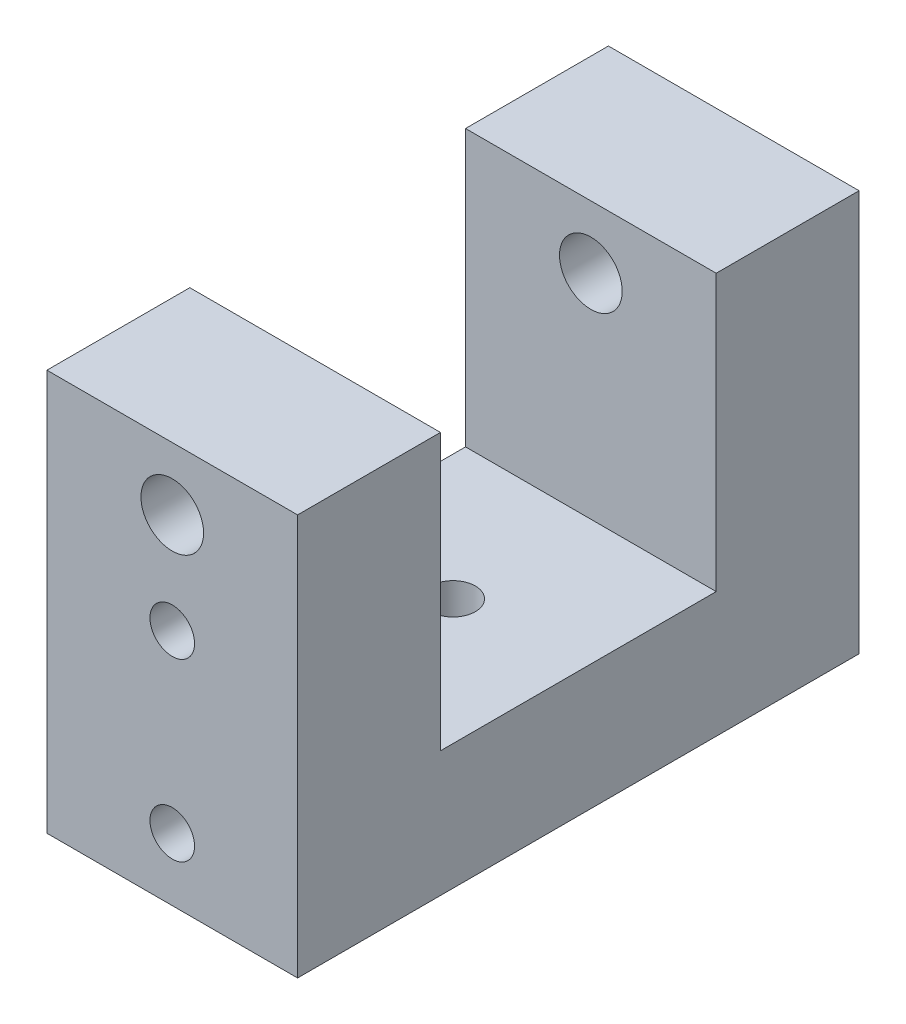
ISO-10303-21;
HEADER;
FILE_DESCRIPTION(('STEP AP214'),'2;1');
FILE_NAME('part.step','',(''),(''),'','','');
FILE_SCHEMA(('AUTOMOTIVE_DESIGN { 1 0 10303 214 1 1 1 1 }'));
ENDSEC;
DATA;
#1=APPLICATION_CONTEXT('core data for automotive mechanical design processes');
#2=APPLICATION_PROTOCOL_DEFINITION('international standard','automotive_design',2000,#1);
#3=PRODUCT_CONTEXT('',#1,'mechanical');
#4=PRODUCT('Part','Part','',(#3));
#5=PRODUCT_RELATED_PRODUCT_CATEGORY('part','',(#4));
#6=PRODUCT_DEFINITION_FORMATION('','',#4);
#7=PRODUCT_DEFINITION_CONTEXT('part definition',#1,'design');
#8=PRODUCT_DEFINITION('design','',#6,#7);
#9=PRODUCT_DEFINITION_SHAPE('','',#8);
#10=(LENGTH_UNIT() NAMED_UNIT(*) SI_UNIT(.MILLI.,.METRE.));
#11=(NAMED_UNIT(*) PLANE_ANGLE_UNIT() SI_UNIT($,.RADIAN.));
#12=(NAMED_UNIT(*) SI_UNIT($,.STERADIAN.) SOLID_ANGLE_UNIT());
#13=UNCERTAINTY_MEASURE_WITH_UNIT(LENGTH_MEASURE(1.E-05),#10,'distance_accuracy_value','');
#14=(GEOMETRIC_REPRESENTATION_CONTEXT(3) GLOBAL_UNCERTAINTY_ASSIGNED_CONTEXT((#13)) GLOBAL_UNIT_ASSIGNED_CONTEXT((#10,
#11,#12)) REPRESENTATION_CONTEXT('',''));
#15=CARTESIAN_POINT('',(0.,0.,0.));
#16=DIRECTION('',(0.,0.,1.));
#17=DIRECTION('',(1.,0.,0.));
#18=AXIS2_PLACEMENT_3D('',#15,#16,#17);
#19=CARTESIAN_POINT('',(0.,20.32,0.));
#20=DIRECTION('',(0.,-1.,0.));
#21=DIRECTION('',(0.,0.,-1.));
#22=AXIS2_PLACEMENT_3D('',#19,#20,#21);
#23=PLANE('',#22);
#24=DIRECTION('',(0.,0.,1.));
#25=VECTOR('',#24,1.);
#26=CARTESIAN_POINT('',(-6.35,20.32,14.224));
#27=LINE('',#26,#25);
#28=CARTESIAN_POINT('',(-6.35,20.32,-14.224));
#29=VERTEX_POINT('',#28);
#30=CARTESIAN_POINT('',(-6.35,20.32,-6.985));
#31=VERTEX_POINT('',#30);
#32=EDGE_CURVE('E201',#29,#31,#27,.T.);
#33=ORIENTED_EDGE('',*,*,#32,.T.);
#34=DIRECTION('',(1.,0.,0.));
#35=VECTOR('',#34,1.);
#36=CARTESIAN_POINT('',(-6.35,20.32,-6.985));
#37=LINE('',#36,#35);
#38=CARTESIAN_POINT('',(6.35,20.32,-6.985));
#39=VERTEX_POINT('',#38);
#40=EDGE_CURVE('E181',#31,#39,#37,.T.);
#41=ORIENTED_EDGE('',*,*,#40,.T.);
#42=DIRECTION('',(0.,0.,-1.));
#43=VECTOR('',#42,1.);
#44=CARTESIAN_POINT('',(6.35,20.32,14.224));
#45=LINE('',#44,#43);
#46=CARTESIAN_POINT('',(6.35,20.32,-14.224));
#47=VERTEX_POINT('',#46);
#48=EDGE_CURVE('E91',#39,#47,#45,.T.);
#49=ORIENTED_EDGE('',*,*,#48,.T.);
#50=DIRECTION('',(-1.,0.,0.));
#51=VECTOR('',#50,1.);
#52=CARTESIAN_POINT('',(-6.35,20.32,-14.224));
#53=LINE('',#52,#51);
#54=EDGE_CURVE('E198',#47,#29,#53,.T.);
#55=ORIENTED_EDGE('',*,*,#54,.T.);
#56=EDGE_LOOP('',(#33,#41,#49,#55));
#57=FACE_BOUND('',#56,.T.);
#58=ADVANCED_FACE('F37',(#57),#23,.F.);
#59=CARTESIAN_POINT('',(6.35,20.32,14.224));
#60=DIRECTION('',(-1.,0.,0.));
#61=DIRECTION('',(0.,0.,1.));
#62=AXIS2_PLACEMENT_3D('',#59,#60,#61);
#63=PLANE('',#62);
#64=ORIENTED_EDGE('',*,*,#48,.F.);
#65=DIRECTION('',(0.,1.,0.));
#66=VECTOR('',#65,1.);
#67=CARTESIAN_POINT('',(6.35,6.35,-6.985));
#68=LINE('',#67,#66);
#69=CARTESIAN_POINT('',(6.35,6.35,-6.985));
#70=VERTEX_POINT('',#69);
#71=EDGE_CURVE('E172',#70,#39,#68,.T.);
#72=ORIENTED_EDGE('',*,*,#71,.F.);
#73=DIRECTION('',(0.,0.,-1.));
#74=VECTOR('',#73,1.);
#75=CARTESIAN_POINT('',(6.35,6.35,6.985));
#76=LINE('',#75,#74);
#77=CARTESIAN_POINT('',(6.35,6.35,6.985));
#78=VERTEX_POINT('',#77);
#79=EDGE_CURVE('E176',#78,#70,#76,.T.);
#80=ORIENTED_EDGE('',*,*,#79,.F.);
#81=DIRECTION('',(0.,-1.,0.));
#82=VECTOR('',#81,1.);
#83=CARTESIAN_POINT('',(6.35,6.35,6.985));
#84=LINE('',#83,#82);
#85=CARTESIAN_POINT('',(6.35,20.32,6.985));
#86=VERTEX_POINT('',#85);
#87=EDGE_CURVE('E183',#86,#78,#84,.T.);
#88=ORIENTED_EDGE('',*,*,#87,.F.);
#89=CARTESIAN_POINT('',(6.35,20.32,14.224));
#90=VERTEX_POINT('',#89);
#91=EDGE_CURVE('E196',#90,#86,#45,.T.);
#92=ORIENTED_EDGE('',*,*,#91,.F.);
#93=DIRECTION('',(0.,-1.,0.));
#94=VECTOR('',#93,1.);
#95=CARTESIAN_POINT('',(6.35,20.32,14.224));
#96=LINE('',#95,#94);
#97=CARTESIAN_POINT('',(6.35,0.,14.224));
#98=VERTEX_POINT('',#97);
#99=EDGE_CURVE('E205',#90,#98,#96,.T.);
#100=ORIENTED_EDGE('',*,*,#99,.T.);
#101=DIRECTION('',(0.,0.,-1.));
#102=VECTOR('',#101,1.);
#103=CARTESIAN_POINT('',(6.35,0.,14.224));
#104=LINE('',#103,#102);
#105=CARTESIAN_POINT('',(6.35,0.,-14.224));
#106=VERTEX_POINT('',#105);
#107=EDGE_CURVE('E190',#98,#106,#104,.T.);
#108=ORIENTED_EDGE('',*,*,#107,.T.);
#109=DIRECTION('',(0.,-1.,0.));
#110=VECTOR('',#109,1.);
#111=CARTESIAN_POINT('',(6.35,20.32,-14.224));
#112=LINE('',#111,#110);
#113=EDGE_CURVE('E11',#47,#106,#112,.T.);
#114=ORIENTED_EDGE('',*,*,#113,.F.);
#115=EDGE_LOOP('',(#64,#72,#80,#88,#92,#100,#108,#114));
#116=FACE_BOUND('',#115,.T.);
#117=ADVANCED_FACE('F39',(#116),#63,.F.);
#118=CARTESIAN_POINT('',(-6.35,20.32,-14.224));
#119=DIRECTION('',(0.,0.,1.));
#120=DIRECTION('',(1.,0.,0.));
#121=AXIS2_PLACEMENT_3D('',#118,#119,#120);
#122=PLANE('',#121);
#123=CARTESIAN_POINT('',(0.,12.065,-14.224));
#124=DIRECTION('',(0.,0.,-1.));
#125=DIRECTION('',(-1.,0.,0.));
#126=AXIS2_PLACEMENT_3D('',#123,#124,#125);
#127=CIRCLE('',#126,1.13029999999999);
#128=CARTESIAN_POINT('',(-1.13029999999999,12.065,-14.224));
#129=VERTEX_POINT('',#128);
#130=EDGE_CURVE('E145',#129,#129,#127,.T.);
#131=ORIENTED_EDGE('',*,*,#130,.F.);
#132=EDGE_LOOP('',(#131));
#133=FACE_BOUND('',#132,.T.);
#134=CARTESIAN_POINT('',(0.,3.175,-14.224));
#135=DIRECTION('',(0.,0.,-1.));
#136=DIRECTION('',(-1.,0.,0.));
#137=AXIS2_PLACEMENT_3D('',#134,#135,#136);
#138=CIRCLE('',#137,1.13029999999999);
#139=CARTESIAN_POINT('',(-1.13029999999999,3.175,-14.224));
#140=VERTEX_POINT('',#139);
#141=EDGE_CURVE('E151',#140,#140,#138,.T.);
#142=ORIENTED_EDGE('',*,*,#141,.F.);
#143=EDGE_LOOP('',(#142));
#144=FACE_BOUND('',#143,.T.);
#145=CARTESIAN_POINT('',(0.,17.145,-14.224));
#146=DIRECTION('',(0.,0.,1.));
#147=DIRECTION('',(1.,0.,0.));
#148=AXIS2_PLACEMENT_3D('',#145,#146,#147);
#149=CIRCLE('',#148,1.5875);
#150=CARTESIAN_POINT('',(1.5875,17.145,-14.224));
#151=VERTEX_POINT('',#150);
#152=EDGE_CURVE('E164',#151,#151,#149,.T.);
#153=ORIENTED_EDGE('',*,*,#152,.T.);
#154=EDGE_LOOP('',(#153));
#155=FACE_BOUND('',#154,.T.);
#156=DIRECTION('',(-1.,0.,0.));
#157=VECTOR('',#156,1.);
#158=CARTESIAN_POINT('',(-6.35,0.,-14.224));
#159=LINE('',#158,#157);
#160=CARTESIAN_POINT('',(-6.35,0.,-14.224));
#161=VERTEX_POINT('',#160);
#162=EDGE_CURVE('E208',#106,#161,#159,.T.);
#163=ORIENTED_EDGE('',*,*,#162,.T.);
#164=DIRECTION('',(0.,-1.,0.));
#165=VECTOR('',#164,1.);
#166=CARTESIAN_POINT('',(-6.35,20.32,-14.224));
#167=LINE('',#166,#165);
#168=EDGE_CURVE('E46',#29,#161,#167,.T.);
#169=ORIENTED_EDGE('',*,*,#168,.F.);
#170=ORIENTED_EDGE('',*,*,#54,.F.);
#171=ORIENTED_EDGE('',*,*,#113,.T.);
#172=EDGE_LOOP('',(#163,#169,#170,#171));
#173=FACE_BOUND('',#172,.T.);
#174=ADVANCED_FACE('F242',(#133,#144,#155,#173),#122,.F.);
#175=CARTESIAN_POINT('',(-6.35,20.32,14.224));
#176=DIRECTION('',(1.,0.,0.));
#177=DIRECTION('',(0.,0.,-1.));
#178=AXIS2_PLACEMENT_3D('',#175,#176,#177);
#179=PLANE('',#178);
#180=DIRECTION('',(0.,0.,-1.));
#181=VECTOR('',#180,1.);
#182=CARTESIAN_POINT('',(-6.35,6.35,6.985));
#183=LINE('',#182,#181);
#184=CARTESIAN_POINT('',(-6.35,6.35,6.985));
#185=VERTEX_POINT('',#184);
#186=CARTESIAN_POINT('',(-6.35,6.35,-6.985));
#187=VERTEX_POINT('',#186);
#188=EDGE_CURVE('E178',#185,#187,#183,.T.);
#189=ORIENTED_EDGE('',*,*,#188,.T.);
#190=DIRECTION('',(0.,1.,0.));
#191=VECTOR('',#190,1.);
#192=CARTESIAN_POINT('',(-6.35,6.35,-6.985));
#193=LINE('',#192,#191);
#194=EDGE_CURVE('E173',#187,#31,#193,.T.);
#195=ORIENTED_EDGE('',*,*,#194,.T.);
#196=ORIENTED_EDGE('',*,*,#32,.F.);
#197=ORIENTED_EDGE('',*,*,#168,.T.);
#198=DIRECTION('',(0.,0.,1.));
#199=VECTOR('',#198,1.);
#200=CARTESIAN_POINT('',(-6.35,0.,14.224));
#201=LINE('',#200,#199);
#202=CARTESIAN_POINT('',(-6.35,0.,14.224));
#203=VERTEX_POINT('',#202);
#204=EDGE_CURVE('E210',#161,#203,#201,.T.);
#205=ORIENTED_EDGE('',*,*,#204,.T.);
#206=DIRECTION('',(0.,-1.,0.));
#207=VECTOR('',#206,1.);
#208=CARTESIAN_POINT('',(-6.35,20.32,14.224));
#209=LINE('',#208,#207);
#210=CARTESIAN_POINT('',(-6.35,20.32,14.224));
#211=VERTEX_POINT('',#210);
#212=EDGE_CURVE('E214',#211,#203,#209,.T.);
#213=ORIENTED_EDGE('',*,*,#212,.F.);
#214=CARTESIAN_POINT('',(-6.35,20.32,6.985));
#215=VERTEX_POINT('',#214);
#216=EDGE_CURVE('E200',#215,#211,#27,.T.);
#217=ORIENTED_EDGE('',*,*,#216,.F.);
#218=DIRECTION('',(0.,-1.,0.));
#219=VECTOR('',#218,1.);
#220=CARTESIAN_POINT('',(-6.35,6.35,6.985));
#221=LINE('',#220,#219);
#222=EDGE_CURVE('E53',#215,#185,#221,.T.);
#223=ORIENTED_EDGE('',*,*,#222,.T.);
#224=EDGE_LOOP('',(#189,#195,#196,#197,#205,#213,#217,#223));
#225=FACE_BOUND('',#224,.T.);
#226=ADVANCED_FACE('F221',(#225),#179,.F.);
#227=CARTESIAN_POINT('',(-6.35,20.32,14.224));
#228=DIRECTION('',(0.,0.,-1.));
#229=DIRECTION('',(-1.,0.,0.));
#230=AXIS2_PLACEMENT_3D('',#227,#228,#229);
#231=PLANE('',#230);
#232=CARTESIAN_POINT('',(0.,12.065,14.224));
#233=DIRECTION('',(0.,0.,1.));
#234=DIRECTION('',(1.,0.,0.));
#235=AXIS2_PLACEMENT_3D('',#232,#233,#234);
#236=CIRCLE('',#235,1.13029999999999);
#237=CARTESIAN_POINT('',(1.13029999999999,12.065,14.224));
#238=VERTEX_POINT('',#237);
#239=EDGE_CURVE('E135',#238,#238,#236,.T.);
#240=ORIENTED_EDGE('',*,*,#239,.F.);
#241=EDGE_LOOP('',(#240));
#242=FACE_BOUND('',#241,.T.);
#243=CARTESIAN_POINT('',(0.,3.175,14.224));
#244=DIRECTION('',(0.,0.,1.));
#245=DIRECTION('',(1.,0.,0.));
#246=AXIS2_PLACEMENT_3D('',#243,#244,#245);
#247=CIRCLE('',#246,1.13029999999999);
#248=CARTESIAN_POINT('',(1.13029999999999,3.175,14.224));
#249=VERTEX_POINT('',#248);
#250=EDGE_CURVE('E134',#249,#249,#247,.T.);
#251=ORIENTED_EDGE('',*,*,#250,.F.);
#252=EDGE_LOOP('',(#251));
#253=FACE_BOUND('',#252,.T.);
#254=CARTESIAN_POINT('',(0.,17.145,14.224));
#255=DIRECTION('',(0.,0.,1.));
#256=DIRECTION('',(1.,0.,0.));
#257=AXIS2_PLACEMENT_3D('',#254,#255,#256);
#258=CIRCLE('',#257,1.5875);
#259=CARTESIAN_POINT('',(1.5875,17.145,14.224));
#260=VERTEX_POINT('',#259);
#261=EDGE_CURVE('E163',#260,#260,#258,.T.);
#262=ORIENTED_EDGE('',*,*,#261,.F.);
#263=EDGE_LOOP('',(#262));
#264=FACE_BOUND('',#263,.T.);
#265=DIRECTION('',(1.,0.,0.));
#266=VECTOR('',#265,1.);
#267=CARTESIAN_POINT('',(-6.35,0.,14.224));
#268=LINE('',#267,#266);
#269=EDGE_CURVE('E83',#203,#98,#268,.T.);
#270=ORIENTED_EDGE('',*,*,#269,.T.);
#271=ORIENTED_EDGE('',*,*,#99,.F.);
#272=DIRECTION('',(1.,0.,0.));
#273=VECTOR('',#272,1.);
#274=CARTESIAN_POINT('',(-6.35,20.32,14.224));
#275=LINE('',#274,#273);
#276=EDGE_CURVE('E62',#211,#90,#275,.T.);
#277=ORIENTED_EDGE('',*,*,#276,.F.);
#278=ORIENTED_EDGE('',*,*,#212,.T.);
#279=EDGE_LOOP('',(#270,#271,#277,#278));
#280=FACE_BOUND('',#279,.T.);
#281=ADVANCED_FACE('F231',(#242,#253,#264,#280),#231,.F.);
#282=ORIENTED_EDGE('',*,*,#91,.T.);
#283=DIRECTION('',(1.,0.,0.));
#284=VECTOR('',#283,1.);
#285=CARTESIAN_POINT('',(-6.35,20.32,6.985));
#286=LINE('',#285,#284);
#287=EDGE_CURVE('E193',#215,#86,#286,.T.);
#288=ORIENTED_EDGE('',*,*,#287,.F.);
#289=ORIENTED_EDGE('',*,*,#216,.T.);
#290=ORIENTED_EDGE('',*,*,#276,.T.);
#291=EDGE_LOOP('',(#282,#288,#289,#290));
#292=FACE_BOUND('',#291,.T.);
#293=ADVANCED_FACE('F233',(#292),#23,.F.);
#294=CARTESIAN_POINT('',(0.,0.,0.));
#295=DIRECTION('',(0.,-1.,0.));
#296=DIRECTION('',(0.,0.,-1.));
#297=AXIS2_PLACEMENT_3D('',#294,#295,#296);
#298=PLANE('',#297);
#299=CARTESIAN_POINT('',(0.,0.,0.));
#300=DIRECTION('',(0.,-1.,0.));
#301=DIRECTION('',(0.,0.,-1.));
#302=AXIS2_PLACEMENT_3D('',#299,#300,#301);
#303=CIRCLE('',#302,1.13029999999999);
#304=CARTESIAN_POINT('',(0.,0.,-1.13029999999999));
#305=VERTEX_POINT('',#304);
#306=EDGE_CURVE('E157',#305,#305,#303,.T.);
#307=ORIENTED_EDGE('',*,*,#306,.F.);
#308=EDGE_LOOP('',(#307));
#309=FACE_BOUND('',#308,.T.);
#310=ORIENTED_EDGE('',*,*,#107,.F.);
#311=ORIENTED_EDGE('',*,*,#269,.F.);
#312=ORIENTED_EDGE('',*,*,#204,.F.);
#313=ORIENTED_EDGE('',*,*,#162,.F.);
#314=EDGE_LOOP('',(#310,#311,#312,#313));
#315=FACE_BOUND('',#314,.T.);
#316=ADVANCED_FACE('F226',(#309,#315),#298,.T.);
#317=CARTESIAN_POINT('',(-6.35,6.35,-6.985));
#318=DIRECTION('',(0.,0.,-1.));
#319=DIRECTION('',(-1.,0.,0.));
#320=AXIS2_PLACEMENT_3D('',#317,#318,#319);
#321=PLANE('',#320);
#322=CARTESIAN_POINT('',(0.,17.145,-6.985));
#323=DIRECTION('',(0.,0.,-1.));
#324=DIRECTION('',(-1.,0.,0.));
#325=AXIS2_PLACEMENT_3D('',#322,#323,#324);
#326=CIRCLE('',#325,1.5875);
#327=CARTESIAN_POINT('',(-1.5875,17.145,-6.985));
#328=VERTEX_POINT('',#327);
#329=EDGE_CURVE('E169',#328,#328,#326,.T.);
#330=ORIENTED_EDGE('',*,*,#329,.T.);
#331=EDGE_LOOP('',(#330));
#332=FACE_BOUND('',#331,.T.);
#333=ORIENTED_EDGE('',*,*,#71,.T.);
#334=ORIENTED_EDGE('',*,*,#40,.F.);
#335=ORIENTED_EDGE('',*,*,#194,.F.);
#336=DIRECTION('',(1.,0.,0.));
#337=VECTOR('',#336,1.);
#338=CARTESIAN_POINT('',(-6.35,6.35,-6.985));
#339=LINE('',#338,#337);
#340=EDGE_CURVE('E188',#187,#70,#339,.T.);
#341=ORIENTED_EDGE('',*,*,#340,.T.);
#342=EDGE_LOOP('',(#333,#334,#335,#341));
#343=FACE_BOUND('',#342,.T.);
#344=ADVANCED_FACE('F263',(#332,#343),#321,.F.);
#345=CARTESIAN_POINT('',(-6.35,6.35,6.985));
#346=DIRECTION('',(0.,-1.,0.));
#347=DIRECTION('',(0.,0.,-1.));
#348=AXIS2_PLACEMENT_3D('',#345,#346,#347);
#349=PLANE('',#348);
#350=CARTESIAN_POINT('',(0.,6.35,0.));
#351=DIRECTION('',(0.,-1.,0.));
#352=DIRECTION('',(0.,0.,-1.));
#353=AXIS2_PLACEMENT_3D('',#350,#351,#352);
#354=CIRCLE('',#353,1.13029999999999);
#355=CARTESIAN_POINT('',(0.,6.35,-1.13029999999999));
#356=VERTEX_POINT('',#355);
#357=EDGE_CURVE('E160',#356,#356,#354,.T.);
#358=ORIENTED_EDGE('',*,*,#357,.T.);
#359=EDGE_LOOP('',(#358));
#360=FACE_BOUND('',#359,.T.);
#361=ORIENTED_EDGE('',*,*,#79,.T.);
#362=ORIENTED_EDGE('',*,*,#340,.F.);
#363=ORIENTED_EDGE('',*,*,#188,.F.);
#364=DIRECTION('',(1.,0.,0.));
#365=VECTOR('',#364,1.);
#366=CARTESIAN_POINT('',(-6.35,6.35,6.985));
#367=LINE('',#366,#365);
#368=EDGE_CURVE('E191',#185,#78,#367,.T.);
#369=ORIENTED_EDGE('',*,*,#368,.T.);
#370=EDGE_LOOP('',(#361,#362,#363,#369));
#371=FACE_BOUND('',#370,.T.);
#372=ADVANCED_FACE('F238',(#360,#371),#349,.F.);
#373=CARTESIAN_POINT('',(-6.35,6.35,6.985));
#374=DIRECTION('',(0.,0.,1.));
#375=DIRECTION('',(1.,0.,0.));
#376=AXIS2_PLACEMENT_3D('',#373,#374,#375);
#377=PLANE('',#376);
#378=CARTESIAN_POINT('',(0.,17.145,6.985));
#379=DIRECTION('',(0.,0.,1.));
#380=DIRECTION('',(1.,0.,0.));
#381=AXIS2_PLACEMENT_3D('',#378,#379,#380);
#382=CIRCLE('',#381,1.5875);
#383=CARTESIAN_POINT('',(1.5875,17.145,6.985));
#384=VERTEX_POINT('',#383);
#385=EDGE_CURVE('E41',#384,#384,#382,.T.);
#386=ORIENTED_EDGE('',*,*,#385,.T.);
#387=EDGE_LOOP('',(#386));
#388=FACE_BOUND('',#387,.T.);
#389=ORIENTED_EDGE('',*,*,#87,.T.);
#390=ORIENTED_EDGE('',*,*,#368,.F.);
#391=ORIENTED_EDGE('',*,*,#222,.F.);
#392=ORIENTED_EDGE('',*,*,#287,.T.);
#393=EDGE_LOOP('',(#389,#390,#391,#392));
#394=FACE_BOUND('',#393,.T.);
#395=ADVANCED_FACE('F234',(#388,#394),#377,.F.);
#396=CARTESIAN_POINT('',(0.,17.145,-14.224));
#397=DIRECTION('',(0.,0.,1.));
#398=DIRECTION('',(1.,0.,0.));
#399=AXIS2_PLACEMENT_3D('',#396,#397,#398);
#400=CYLINDRICAL_SURFACE('',#399,1.5875);
#401=ORIENTED_EDGE('',*,*,#261,.T.);
#402=EDGE_LOOP('',(#401));
#403=FACE_BOUND('',#402,.T.);
#404=ORIENTED_EDGE('',*,*,#385,.F.);
#405=EDGE_LOOP('',(#404));
#406=FACE_BOUND('',#405,.T.);
#407=ADVANCED_FACE('F275',(#403,#406),#400,.F.);
#408=ORIENTED_EDGE('',*,*,#152,.F.);
#409=EDGE_LOOP('',(#408));
#410=FACE_BOUND('',#409,.T.);
#411=ORIENTED_EDGE('',*,*,#329,.F.);
#412=EDGE_LOOP('',(#411));
#413=FACE_BOUND('',#412,.T.);
#414=ADVANCED_FACE('F278',(#410,#413),#400,.F.);
#415=CARTESIAN_POINT('',(0.,0.,0.));
#416=DIRECTION('',(0.,-1.,0.));
#417=DIRECTION('',(0.,0.,-1.));
#418=AXIS2_PLACEMENT_3D('',#415,#416,#417);
#419=CYLINDRICAL_SURFACE('',#418,1.13029999999999);
#420=ORIENTED_EDGE('',*,*,#357,.F.);
#421=EDGE_LOOP('',(#420));
#422=FACE_BOUND('',#421,.T.);
#423=ORIENTED_EDGE('',*,*,#306,.T.);
#424=EDGE_LOOP('',(#423));
#425=FACE_BOUND('',#424,.T.);
#426=ADVANCED_FACE('F297',(#422,#425),#419,.F.);
#427=CARTESIAN_POINT('',(0.,3.175,-7.874));
#428=DIRECTION('',(0.,0.,-1.));
#429=DIRECTION('',(-1.,0.,0.));
#430=AXIS2_PLACEMENT_3D('',#427,#428,#429);
#431=CONICAL_SURFACE('',#430,1.1303,1.02974425867665);
#432=CARTESIAN_POINT('',(0.,3.175,-7.19484724231315));
#433=VERTEX_POINT('',#432);
#434=VERTEX_LOOP('',#433);
#435=FACE_BOUND('',#434,.T.);
#436=CARTESIAN_POINT('',(0.,3.175,-7.874));
#437=DIRECTION('',(0.,0.,-1.));
#438=DIRECTION('',(-1.,0.,0.));
#439=AXIS2_PLACEMENT_3D('',#436,#437,#438);
#440=CIRCLE('',#439,1.1303);
#441=CARTESIAN_POINT('',(-1.1303,3.175,-7.874));
#442=VERTEX_POINT('',#441);
#443=EDGE_CURVE('E154',#442,#442,#440,.T.);
#444=ORIENTED_EDGE('',*,*,#443,.T.);
#445=EDGE_LOOP('',(#444));
#446=FACE_BOUND('',#445,.T.);
#447=ADVANCED_FACE('F302',(#435,#446),#431,.F.);
#448=CARTESIAN_POINT('',(0.,3.175,-14.224));
#449=DIRECTION('',(0.,0.,-1.));
#450=DIRECTION('',(-1.,0.,0.));
#451=AXIS2_PLACEMENT_3D('',#448,#449,#450);
#452=CYLINDRICAL_SURFACE('',#451,1.13029999999999);
#453=ORIENTED_EDGE('',*,*,#443,.F.);
#454=EDGE_LOOP('',(#453));
#455=FACE_BOUND('',#454,.T.);
#456=ORIENTED_EDGE('',*,*,#141,.T.);
#457=EDGE_LOOP('',(#456));
#458=FACE_BOUND('',#457,.T.);
#459=ADVANCED_FACE('F309',(#455,#458),#452,.F.);
#460=CARTESIAN_POINT('',(0.,12.065,-7.874));
#461=DIRECTION('',(0.,0.,-1.));
#462=DIRECTION('',(-1.,0.,0.));
#463=AXIS2_PLACEMENT_3D('',#460,#461,#462);
#464=CONICAL_SURFACE('',#463,1.1303,1.02974425867665);
#465=CARTESIAN_POINT('',(0.,12.065,-7.19484724231315));
#466=VERTEX_POINT('',#465);
#467=VERTEX_LOOP('',#466);
#468=FACE_BOUND('',#467,.T.);
#469=CARTESIAN_POINT('',(0.,12.065,-7.874));
#470=DIRECTION('',(0.,0.,-1.));
#471=DIRECTION('',(-1.,0.,0.));
#472=AXIS2_PLACEMENT_3D('',#469,#470,#471);
#473=CIRCLE('',#472,1.1303);
#474=CARTESIAN_POINT('',(-1.1303,12.065,-7.874));
#475=VERTEX_POINT('',#474);
#476=EDGE_CURVE('E148',#475,#475,#473,.T.);
#477=ORIENTED_EDGE('',*,*,#476,.T.);
#478=EDGE_LOOP('',(#477));
#479=FACE_BOUND('',#478,.T.);
#480=ADVANCED_FACE('F313',(#468,#479),#464,.F.);
#481=CARTESIAN_POINT('',(0.,12.065,-14.224));
#482=DIRECTION('',(0.,0.,-1.));
#483=DIRECTION('',(-1.,0.,0.));
#484=AXIS2_PLACEMENT_3D('',#481,#482,#483);
#485=CYLINDRICAL_SURFACE('',#484,1.13029999999999);
#486=ORIENTED_EDGE('',*,*,#476,.F.);
#487=EDGE_LOOP('',(#486));
#488=FACE_BOUND('',#487,.T.);
#489=ORIENTED_EDGE('',*,*,#130,.T.);
#490=EDGE_LOOP('',(#489));
#491=FACE_BOUND('',#490,.T.);
#492=ADVANCED_FACE('F317',(#488,#491),#485,.F.);
#493=CARTESIAN_POINT('',(0.,3.175,7.874));
#494=DIRECTION('',(0.,0.,1.));
#495=DIRECTION('',(1.,0.,0.));
#496=AXIS2_PLACEMENT_3D('',#493,#494,#495);
#497=CONICAL_SURFACE('',#496,1.1303,1.02974425867665);
#498=CARTESIAN_POINT('',(0.,3.175,7.19484724231315));
#499=VERTEX_POINT('',#498);
#500=VERTEX_LOOP('',#499);
#501=FACE_BOUND('',#500,.T.);
#502=CARTESIAN_POINT('',(0.,3.175,7.874));
#503=DIRECTION('',(0.,0.,1.));
#504=DIRECTION('',(1.,0.,0.));
#505=AXIS2_PLACEMENT_3D('',#502,#503,#504);
#506=CIRCLE('',#505,1.1303);
#507=CARTESIAN_POINT('',(1.1303,3.175,7.874));
#508=VERTEX_POINT('',#507);
#509=EDGE_CURVE('E138',#508,#508,#506,.T.);
#510=ORIENTED_EDGE('',*,*,#509,.T.);
#511=EDGE_LOOP('',(#510));
#512=FACE_BOUND('',#511,.T.);
#513=ADVANCED_FACE('F321',(#501,#512),#497,.F.);
#514=CARTESIAN_POINT('',(0.,3.175,14.224));
#515=DIRECTION('',(0.,0.,1.));
#516=DIRECTION('',(1.,0.,0.));
#517=AXIS2_PLACEMENT_3D('',#514,#515,#516);
#518=CYLINDRICAL_SURFACE('',#517,1.13029999999999);
#519=ORIENTED_EDGE('',*,*,#509,.F.);
#520=EDGE_LOOP('',(#519));
#521=FACE_BOUND('',#520,.T.);
#522=ORIENTED_EDGE('',*,*,#250,.T.);
#523=EDGE_LOOP('',(#522));
#524=FACE_BOUND('',#523,.T.);
#525=ADVANCED_FACE('F128',(#521,#524),#518,.F.);
#526=CARTESIAN_POINT('',(0.,12.065,7.874));
#527=DIRECTION('',(0.,0.,1.));
#528=DIRECTION('',(1.,0.,0.));
#529=AXIS2_PLACEMENT_3D('',#526,#527,#528);
#530=CONICAL_SURFACE('',#529,1.1303,1.02974425867665);
#531=CARTESIAN_POINT('',(0.,12.065,7.19484724231315));
#532=VERTEX_POINT('',#531);
#533=VERTEX_LOOP('',#532);
#534=FACE_BOUND('',#533,.T.);
#535=CARTESIAN_POINT('',(0.,12.065,7.874));
#536=DIRECTION('',(0.,0.,1.));
#537=DIRECTION('',(1.,0.,0.));
#538=AXIS2_PLACEMENT_3D('',#535,#536,#537);
#539=CIRCLE('',#538,1.1303);
#540=CARTESIAN_POINT('',(1.1303,12.065,7.874));
#541=VERTEX_POINT('',#540);
#542=EDGE_CURVE('E132',#541,#541,#539,.T.);
#543=ORIENTED_EDGE('',*,*,#542,.T.);
#544=EDGE_LOOP('',(#543));
#545=FACE_BOUND('',#544,.T.);
#546=ADVANCED_FACE('F124',(#534,#545),#530,.F.);
#547=CARTESIAN_POINT('',(0.,12.065,14.224));
#548=DIRECTION('',(0.,0.,1.));
#549=DIRECTION('',(1.,0.,0.));
#550=AXIS2_PLACEMENT_3D('',#547,#548,#549);
#551=CYLINDRICAL_SURFACE('',#550,1.13029999999999);
#552=ORIENTED_EDGE('',*,*,#542,.F.);
#553=EDGE_LOOP('',(#552));
#554=FACE_BOUND('',#553,.T.);
#555=ORIENTED_EDGE('',*,*,#239,.T.);
#556=EDGE_LOOP('',(#555));
#557=FACE_BOUND('',#556,.T.);
#558=ADVANCED_FACE('F127',(#554,#557),#551,.F.);
#559=CLOSED_SHELL('',(#58,#117,#174,#226,#281,#293,#316,#344,#372,#395,#407,#414,#426,#447,#459,
#480,#492,#513,#525,#546,#558));
#560=MANIFOLD_SOLID_BREP('B2',#559);
#561=ADVANCED_BREP_SHAPE_REPRESENTATION('',(#18,#560),#14);
#562=SHAPE_DEFINITION_REPRESENTATION(#9,#561);
ENDSEC;
END-ISO-10303-21;
